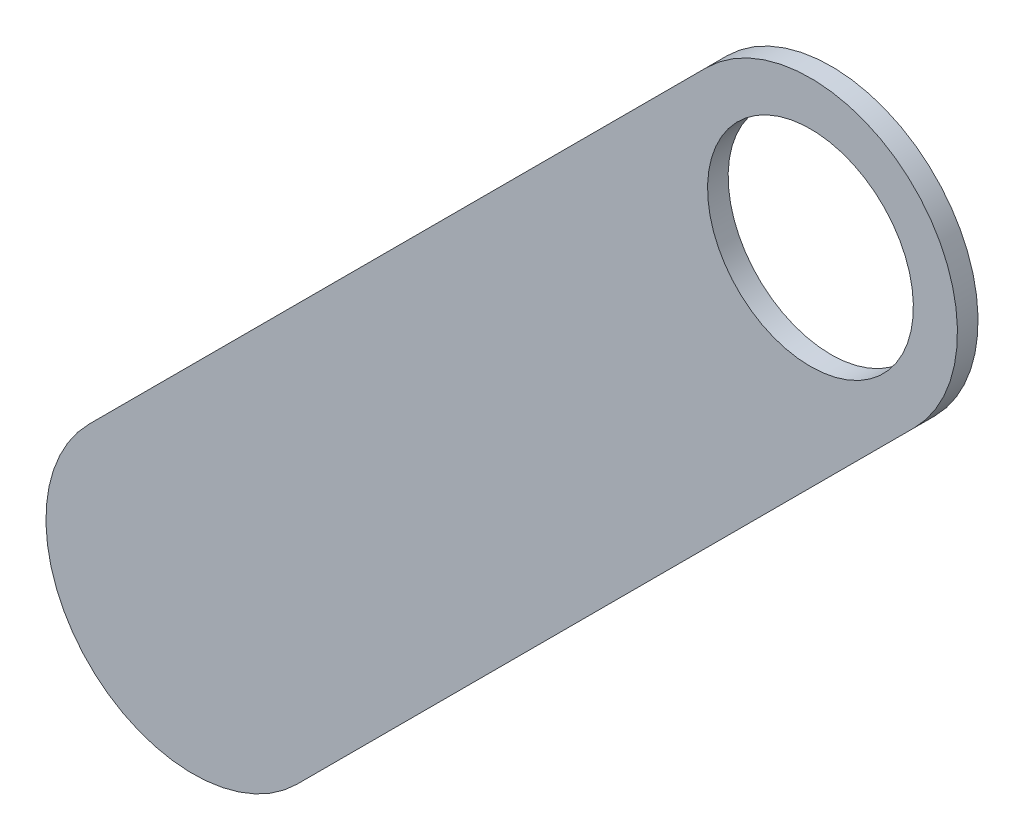
ISO-10303-21;
HEADER;
FILE_DESCRIPTION(('STEP AP214'),'2;1');
FILE_NAME('part.step','',(''),(''),'','','');
FILE_SCHEMA(('AUTOMOTIVE_DESIGN { 1 0 10303 214 1 1 1 1 }'));
ENDSEC;
DATA;
#1=APPLICATION_CONTEXT('core data for automotive mechanical design processes');
#2=APPLICATION_PROTOCOL_DEFINITION('international standard','automotive_design',2000,#1);
#3=PRODUCT_CONTEXT('',#1,'mechanical');
#4=PRODUCT('Part','Part','',(#3));
#5=PRODUCT_RELATED_PRODUCT_CATEGORY('part','',(#4));
#6=PRODUCT_DEFINITION_FORMATION('','',#4);
#7=PRODUCT_DEFINITION_CONTEXT('part definition',#1,'design');
#8=PRODUCT_DEFINITION('design','',#6,#7);
#9=PRODUCT_DEFINITION_SHAPE('','',#8);
#10=(LENGTH_UNIT() NAMED_UNIT(*) SI_UNIT(.MILLI.,.METRE.));
#11=(NAMED_UNIT(*) PLANE_ANGLE_UNIT() SI_UNIT($,.RADIAN.));
#12=(NAMED_UNIT(*) SI_UNIT($,.STERADIAN.) SOLID_ANGLE_UNIT());
#13=UNCERTAINTY_MEASURE_WITH_UNIT(LENGTH_MEASURE(1.E-05),#10,'distance_accuracy_value','');
#14=(GEOMETRIC_REPRESENTATION_CONTEXT(3) GLOBAL_UNCERTAINTY_ASSIGNED_CONTEXT((#13)) GLOBAL_UNIT_ASSIGNED_CONTEXT((#10,
#11,#12)) REPRESENTATION_CONTEXT('',''));
#15=CARTESIAN_POINT('',(0.,0.,0.));
#16=DIRECTION('',(0.,0.,1.));
#17=DIRECTION('',(1.,0.,0.));
#18=AXIS2_PLACEMENT_3D('',#15,#16,#17);
#19=CARTESIAN_POINT('',(134.3,-59.74,-0.045));
#20=DIRECTION('',(0.,0.,-1.));
#21=DIRECTION('',(0.,-1.,0.));
#22=AXIS2_PLACEMENT_3D('',#19,#20,#21);
#23=CYLINDRICAL_SURFACE('',#22,0.175);
#24=CARTESIAN_POINT('',(134.3,-59.74,1.6));
#25=DIRECTION('',(0.,0.,-1.));
#26=DIRECTION('',(0.,-1.,0.));
#27=AXIS2_PLACEMENT_3D('',#24,#25,#26);
#28=CIRCLE('',#27,0.175);
#29=CARTESIAN_POINT('',(134.3,-59.915,1.6));
#30=VERTEX_POINT('',#29);
#31=EDGE_CURVE('E75',#30,#30,#28,.T.);
#32=ORIENTED_EDGE('',*,*,#31,.T.);
#33=DIRECTION('',(0.,0.,1.));
#34=VECTOR('',#33,1.);
#35=CARTESIAN_POINT('',(134.3,-59.915,-0.045));
#36=LINE('',#35,#34);
#37=CARTESIAN_POINT('',(134.3,-59.915,1.635));
#38=VERTEX_POINT('',#37);
#39=EDGE_CURVE('E11',#30,#38,#36,.T.);
#40=ORIENTED_EDGE('',*,*,#39,.T.);
#41=CARTESIAN_POINT('',(134.3,-59.74,1.635));
#42=DIRECTION('',(0.,0.,-1.));
#43=DIRECTION('',(0.,-1.,0.));
#44=AXIS2_PLACEMENT_3D('',#41,#42,#43);
#45=CIRCLE('',#44,0.175);
#46=EDGE_CURVE('E26',#38,#38,#45,.T.);
#47=ORIENTED_EDGE('',*,*,#46,.F.);
#48=ORIENTED_EDGE('',*,*,#39,.F.);
#49=EDGE_LOOP('',(#32,#40,#47,#48));
#50=FACE_BOUND('',#49,.T.);
#51=ADVANCED_FACE('F17',(#50),#23,.F.);
#52=CARTESIAN_POINT('',(133.426776,-60.966776,1.6));
#53=DIRECTION('',(-0.707106781186548,0.707106781186548,0.));
#54=DIRECTION('',(0.,0.,1.));
#55=AXIS2_PLACEMENT_3D('',#52,#53,#54);
#56=PLANE('',#55);
#57=DIRECTION('',(0.707106781186548,0.707106781186548,0.));
#58=VECTOR('',#57,1.);
#59=CARTESIAN_POINT('',(133.426776,-60.966776,1.6));
#60=LINE('',#59,#58);
#61=CARTESIAN_POINT('',(133.426776,-60.966776,1.6));
#62=VERTEX_POINT('',#61);
#63=CARTESIAN_POINT('',(134.476776,-59.916776,1.6));
#64=VERTEX_POINT('',#63);
#65=EDGE_CURVE('E61',#62,#64,#60,.T.);
#66=ORIENTED_EDGE('',*,*,#65,.T.);
#67=DIRECTION('',(0.,0.,1.));
#68=VECTOR('',#67,1.);
#69=CARTESIAN_POINT('',(134.476776,-59.916776,1.6));
#70=LINE('',#69,#68);
#71=CARTESIAN_POINT('',(134.476776,-59.916776,1.635));
#72=VERTEX_POINT('',#71);
#73=EDGE_CURVE('E91',#64,#72,#70,.T.);
#74=ORIENTED_EDGE('',*,*,#73,.T.);
#75=DIRECTION('',(0.707106781186548,0.707106781186548,0.));
#76=VECTOR('',#75,1.);
#77=CARTESIAN_POINT('',(133.426776,-60.966776,1.635));
#78=LINE('',#77,#76);
#79=CARTESIAN_POINT('',(133.426776,-60.966776,1.635));
#80=VERTEX_POINT('',#79);
#81=EDGE_CURVE('E20',#80,#72,#78,.T.);
#82=ORIENTED_EDGE('',*,*,#81,.F.);
#83=DIRECTION('',(0.,0.,1.));
#84=VECTOR('',#83,1.);
#85=CARTESIAN_POINT('',(133.426776,-60.966776,1.6));
#86=LINE('',#85,#84);
#87=EDGE_CURVE('E79',#62,#80,#86,.T.);
#88=ORIENTED_EDGE('',*,*,#87,.F.);
#89=EDGE_LOOP('',(#66,#74,#82,#88));
#90=FACE_BOUND('',#89,.T.);
#91=ADVANCED_FACE('F80',(#90),#56,.F.);
#92=CARTESIAN_POINT('',(134.123223,-59.563223,1.635));
#93=DIRECTION('',(0.,0.,1.));
#94=DIRECTION('',(1.,0.,0.));
#95=AXIS2_PLACEMENT_3D('',#92,#93,#94);
#96=PLANE('',#95);
#97=ORIENTED_EDGE('',*,*,#46,.T.);
#98=EDGE_LOOP('',(#97));
#99=FACE_BOUND('',#98,.T.);
#100=DIRECTION('',(-0.707106781186548,-0.707106781186548,0.));
#101=VECTOR('',#100,1.);
#102=CARTESIAN_POINT('',(134.123223,-59.563223,1.635));
#103=LINE('',#102,#101);
#104=CARTESIAN_POINT('',(134.123223,-59.563223,1.635));
#105=VERTEX_POINT('',#104);
#106=CARTESIAN_POINT('',(133.073223,-60.613223,1.635));
#107=VERTEX_POINT('',#106);
#108=EDGE_CURVE('E109',#105,#107,#103,.T.);
#109=ORIENTED_EDGE('',*,*,#108,.T.);
#110=CARTESIAN_POINT('',(133.2499995,-60.7899995,1.635));
#111=DIRECTION('',(0.,0.,1.));
#112=DIRECTION('',(-0.707106781186548,0.707106781186548,0.));
#113=AXIS2_PLACEMENT_3D('',#110,#111,#112);
#114=CIRCLE('',#113,0.249999723809);
#115=EDGE_CURVE('E76',#107,#80,#114,.T.);
#116=ORIENTED_EDGE('',*,*,#115,.T.);
#117=ORIENTED_EDGE('',*,*,#81,.T.);
#118=CARTESIAN_POINT('',(134.2999995,-59.7399995,1.635));
#119=DIRECTION('',(0.,0.,1.));
#120=DIRECTION('',(0.707106781186548,-0.707106781186548,0.));
#121=AXIS2_PLACEMENT_3D('',#118,#119,#120);
#122=CIRCLE('',#121,0.249999723809);
#123=EDGE_CURVE('E97',#72,#105,#122,.T.);
#124=ORIENTED_EDGE('',*,*,#123,.T.);
#125=EDGE_LOOP('',(#109,#116,#117,#124));
#126=FACE_BOUND('',#125,.T.);
#127=ADVANCED_FACE('F105',(#99,#126),#96,.T.);
#128=CARTESIAN_POINT('',(134.123223,-59.563223,1.6));
#129=DIRECTION('',(0.,0.,1.));
#130=DIRECTION('',(1.,0.,0.));
#131=AXIS2_PLACEMENT_3D('',#128,#129,#130);
#132=PLANE('',#131);
#133=ORIENTED_EDGE('',*,*,#31,.F.);
#134=EDGE_LOOP('',(#133));
#135=FACE_BOUND('',#134,.T.);
#136=CARTESIAN_POINT('',(134.2999995,-59.7399995,1.6));
#137=DIRECTION('',(0.,0.,1.));
#138=DIRECTION('',(0.707106781186548,-0.707106781186548,0.));
#139=AXIS2_PLACEMENT_3D('',#136,#137,#138);
#140=CIRCLE('',#139,0.249999723809);
#141=CARTESIAN_POINT('',(134.123223,-59.563223,1.6));
#142=VERTEX_POINT('',#141);
#143=EDGE_CURVE('E70',#64,#142,#140,.T.);
#144=ORIENTED_EDGE('',*,*,#143,.F.);
#145=ORIENTED_EDGE('',*,*,#65,.F.);
#146=CARTESIAN_POINT('',(133.2499995,-60.7899995,1.6));
#147=DIRECTION('',(0.,0.,1.));
#148=DIRECTION('',(-0.707106781186548,0.707106781186548,0.));
#149=AXIS2_PLACEMENT_3D('',#146,#147,#148);
#150=CIRCLE('',#149,0.249999723809);
#151=CARTESIAN_POINT('',(133.073223,-60.613223,1.6));
#152=VERTEX_POINT('',#151);
#153=EDGE_CURVE('E67',#152,#62,#150,.T.);
#154=ORIENTED_EDGE('',*,*,#153,.F.);
#155=DIRECTION('',(-0.707106781186548,-0.707106781186548,0.));
#156=VECTOR('',#155,1.);
#157=CARTESIAN_POINT('',(134.123223,-59.563223,1.6));
#158=LINE('',#157,#156);
#159=EDGE_CURVE('E132',#142,#152,#158,.T.);
#160=ORIENTED_EDGE('',*,*,#159,.F.);
#161=EDGE_LOOP('',(#144,#145,#154,#160));
#162=FACE_BOUND('',#161,.T.);
#163=ADVANCED_FACE('F63',(#135,#162),#132,.F.);
#164=CARTESIAN_POINT('',(133.2499995,-60.7899995,1.6));
#165=DIRECTION('',(0.,0.,-1.));
#166=DIRECTION('',(-0.707106781186548,0.707106781186548,0.));
#167=AXIS2_PLACEMENT_3D('',#164,#165,#166);
#168=CYLINDRICAL_SURFACE('',#167,0.249999723809);
#169=ORIENTED_EDGE('',*,*,#153,.T.);
#170=ORIENTED_EDGE('',*,*,#87,.T.);
#171=ORIENTED_EDGE('',*,*,#115,.F.);
#172=DIRECTION('',(0.,0.,1.));
#173=VECTOR('',#172,1.);
#174=CARTESIAN_POINT('',(133.073223,-60.613223,1.6));
#175=LINE('',#174,#173);
#176=EDGE_CURVE('E88',#152,#107,#175,.T.);
#177=ORIENTED_EDGE('',*,*,#176,.F.);
#178=EDGE_LOOP('',(#169,#170,#171,#177));
#179=FACE_BOUND('',#178,.T.);
#180=ADVANCED_FACE('F86',(#179),#168,.T.);
#181=CARTESIAN_POINT('',(134.2999995,-59.7399995,1.6));
#182=DIRECTION('',(0.,0.,-1.));
#183=DIRECTION('',(0.707106781186548,-0.707106781186548,0.));
#184=AXIS2_PLACEMENT_3D('',#181,#182,#183);
#185=CYLINDRICAL_SURFACE('',#184,0.249999723809);
#186=ORIENTED_EDGE('',*,*,#143,.T.);
#187=DIRECTION('',(0.,0.,1.));
#188=VECTOR('',#187,1.);
#189=CARTESIAN_POINT('',(134.123223,-59.563223,1.6));
#190=LINE('',#189,#188);
#191=EDGE_CURVE('E127',#142,#105,#190,.T.);
#192=ORIENTED_EDGE('',*,*,#191,.T.);
#193=ORIENTED_EDGE('',*,*,#123,.F.);
#194=ORIENTED_EDGE('',*,*,#73,.F.);
#195=EDGE_LOOP('',(#186,#192,#193,#194));
#196=FACE_BOUND('',#195,.T.);
#197=ADVANCED_FACE('F125',(#196),#185,.T.);
#198=CARTESIAN_POINT('',(134.123223,-59.563223,1.6));
#199=DIRECTION('',(0.707106781186548,-0.707106781186548,0.));
#200=DIRECTION('',(0.,0.,-1.));
#201=AXIS2_PLACEMENT_3D('',#198,#199,#200);
#202=PLANE('',#201);
#203=ORIENTED_EDGE('',*,*,#159,.T.);
#204=ORIENTED_EDGE('',*,*,#176,.T.);
#205=ORIENTED_EDGE('',*,*,#108,.F.);
#206=ORIENTED_EDGE('',*,*,#191,.F.);
#207=EDGE_LOOP('',(#203,#204,#205,#206));
#208=FACE_BOUND('',#207,.T.);
#209=ADVANCED_FACE('F131',(#208),#202,.F.);
#210=CLOSED_SHELL('',(#51,#91,#127,#163,#180,#197,#209));
#211=MANIFOLD_SOLID_BREP('B1',#210);
#212=ADVANCED_BREP_SHAPE_REPRESENTATION('',(#18,#211),#14);
#213=SHAPE_DEFINITION_REPRESENTATION(#9,#212);
ENDSEC;
END-ISO-10303-21;
